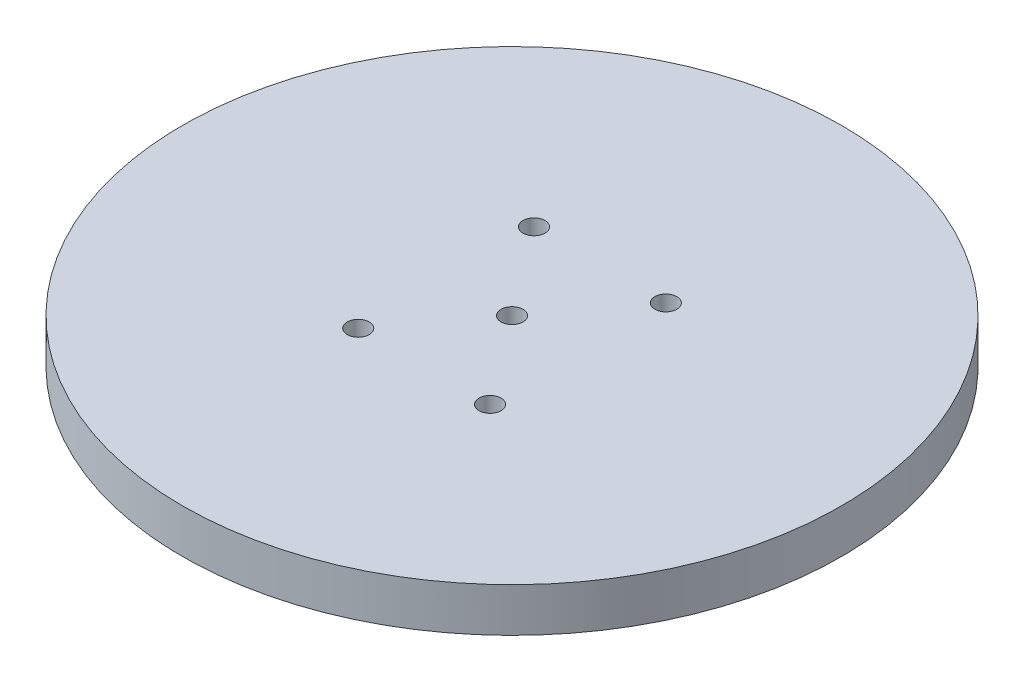
ISO-10303-21;
HEADER;
FILE_DESCRIPTION(('STEP AP214'),'2;1');
FILE_NAME('part.step','',(''),(''),'','','');
FILE_SCHEMA(('AUTOMOTIVE_DESIGN { 1 0 10303 214 1 1 1 1 }'));
ENDSEC;
DATA;
#1=APPLICATION_CONTEXT('core data for automotive mechanical design processes');
#2=APPLICATION_PROTOCOL_DEFINITION('international standard','automotive_design',2000,#1);
#3=PRODUCT_CONTEXT('',#1,'mechanical');
#4=PRODUCT('Part','Part','',(#3));
#5=PRODUCT_RELATED_PRODUCT_CATEGORY('part','',(#4));
#6=PRODUCT_DEFINITION_FORMATION('','',#4);
#7=PRODUCT_DEFINITION_CONTEXT('part definition',#1,'design');
#8=PRODUCT_DEFINITION('design','',#6,#7);
#9=PRODUCT_DEFINITION_SHAPE('','',#8);
#10=(LENGTH_UNIT() NAMED_UNIT(*) SI_UNIT(.MILLI.,.METRE.));
#11=(NAMED_UNIT(*) PLANE_ANGLE_UNIT() SI_UNIT($,.RADIAN.));
#12=(NAMED_UNIT(*) SI_UNIT($,.STERADIAN.) SOLID_ANGLE_UNIT());
#13=UNCERTAINTY_MEASURE_WITH_UNIT(LENGTH_MEASURE(1.E-05),#10,'distance_accuracy_value','');
#14=(GEOMETRIC_REPRESENTATION_CONTEXT(3) GLOBAL_UNCERTAINTY_ASSIGNED_CONTEXT((#13)) GLOBAL_UNIT_ASSIGNED_CONTEXT((#10,
#11,#12)) REPRESENTATION_CONTEXT('',''));
#15=CARTESIAN_POINT('',(0.,0.,0.));
#16=DIRECTION('',(0.,0.,1.));
#17=DIRECTION('',(1.,0.,0.));
#18=AXIS2_PLACEMENT_3D('',#15,#16,#17);
#19=CARTESIAN_POINT('',(0.,30.,0.));
#20=DIRECTION('',(0.,-1.,0.));
#21=DIRECTION('',(0.,0.,-1.));
#22=AXIS2_PLACEMENT_3D('',#19,#20,#21);
#23=CYLINDRICAL_SURFACE('',#22,75.);
#24=CARTESIAN_POINT('',(0.,30.,0.));
#25=DIRECTION('',(0.,1.,0.));
#26=DIRECTION('',(0.,0.,1.));
#27=AXIS2_PLACEMENT_3D('',#24,#25,#26);
#28=CIRCLE('',#27,75.);
#29=CARTESIAN_POINT('',(0.,30.,75.));
#30=VERTEX_POINT('',#29);
#31=EDGE_CURVE('E10',#30,#30,#28,.T.);
#32=ORIENTED_EDGE('',*,*,#31,.F.);
#33=EDGE_LOOP('',(#32));
#34=FACE_BOUND('',#33,.T.);
#35=CARTESIAN_POINT('',(0.,20.,0.));
#36=DIRECTION('',(0.,-1.,0.));
#37=DIRECTION('',(0.,0.,-1.));
#38=AXIS2_PLACEMENT_3D('',#35,#36,#37);
#39=CIRCLE('',#38,75.);
#40=CARTESIAN_POINT('',(0.,20.,-75.));
#41=VERTEX_POINT('',#40);
#42=EDGE_CURVE('E38',#41,#41,#39,.T.);
#43=ORIENTED_EDGE('',*,*,#42,.F.);
#44=EDGE_LOOP('',(#43));
#45=FACE_BOUND('',#44,.T.);
#46=ADVANCED_FACE('F32',(#34,#45),#23,.T.);
#47=CARTESIAN_POINT('',(0.,30.,0.));
#48=DIRECTION('',(0.,1.,0.));
#49=DIRECTION('',(0.,0.,1.));
#50=AXIS2_PLACEMENT_3D('',#47,#48,#49);
#51=PLANE('',#50);
#52=CARTESIAN_POINT('',(15.,30.,-20.));
#53=DIRECTION('',(0.,1.,0.));
#54=DIRECTION('',(0.,0.,1.));
#55=AXIS2_PLACEMENT_3D('',#52,#53,#54);
#56=CIRCLE('',#55,2.5);
#57=CARTESIAN_POINT('',(15.,30.,-17.5));
#58=VERTEX_POINT('',#57);
#59=EDGE_CURVE('E61',#58,#58,#56,.T.);
#60=ORIENTED_EDGE('',*,*,#59,.F.);
#61=EDGE_LOOP('',(#60));
#62=FACE_BOUND('',#61,.T.);
#63=CARTESIAN_POINT('',(-15.,30.,20.));
#64=DIRECTION('',(0.,1.,0.));
#65=DIRECTION('',(0.,0.,1.));
#66=AXIS2_PLACEMENT_3D('',#63,#64,#65);
#67=CIRCLE('',#66,2.5);
#68=CARTESIAN_POINT('',(-15.,30.,22.5));
#69=VERTEX_POINT('',#68);
#70=EDGE_CURVE('E67',#69,#69,#67,.T.);
#71=ORIENTED_EDGE('',*,*,#70,.F.);
#72=EDGE_LOOP('',(#71));
#73=FACE_BOUND('',#72,.T.);
#74=CARTESIAN_POINT('',(15.,30.,20.));
#75=DIRECTION('',(0.,1.,0.));
#76=DIRECTION('',(0.,0.,1.));
#77=AXIS2_PLACEMENT_3D('',#74,#75,#76);
#78=CIRCLE('',#77,2.5);
#79=CARTESIAN_POINT('',(15.,30.,22.5));
#80=VERTEX_POINT('',#79);
#81=EDGE_CURVE('E68',#80,#80,#78,.T.);
#82=ORIENTED_EDGE('',*,*,#81,.F.);
#83=EDGE_LOOP('',(#82));
#84=FACE_BOUND('',#83,.T.);
#85=CARTESIAN_POINT('',(-15.,30.,-20.));
#86=DIRECTION('',(0.,1.,0.));
#87=DIRECTION('',(0.,0.,1.));
#88=AXIS2_PLACEMENT_3D('',#85,#86,#87);
#89=CIRCLE('',#88,2.5);
#90=CARTESIAN_POINT('',(-15.,30.,-17.5));
#91=VERTEX_POINT('',#90);
#92=EDGE_CURVE('E58',#91,#91,#89,.T.);
#93=ORIENTED_EDGE('',*,*,#92,.F.);
#94=EDGE_LOOP('',(#93));
#95=FACE_BOUND('',#94,.T.);
#96=CARTESIAN_POINT('',(0.,30.,0.));
#97=DIRECTION('',(0.,1.,0.));
#98=DIRECTION('',(0.,0.,1.));
#99=AXIS2_PLACEMENT_3D('',#96,#97,#98);
#100=CIRCLE('',#99,2.5);
#101=CARTESIAN_POINT('',(0.,30.,2.5));
#102=VERTEX_POINT('',#101);
#103=EDGE_CURVE('E52',#102,#102,#100,.T.);
#104=ORIENTED_EDGE('',*,*,#103,.F.);
#105=EDGE_LOOP('',(#104));
#106=FACE_BOUND('',#105,.T.);
#107=ORIENTED_EDGE('',*,*,#31,.T.);
#108=EDGE_LOOP('',(#107));
#109=FACE_BOUND('',#108,.T.);
#110=ADVANCED_FACE('F84',(#62,#73,#84,#95,#106,#109),#51,.T.);
#111=CARTESIAN_POINT('',(0.,20.,0.));
#112=DIRECTION('',(0.,-1.,0.));
#113=DIRECTION('',(0.,0.,-1.));
#114=AXIS2_PLACEMENT_3D('',#111,#112,#113);
#115=PLANE('',#114);
#116=CARTESIAN_POINT('',(15.,20.,-20.));
#117=DIRECTION('',(0.,1.,0.));
#118=DIRECTION('',(0.,0.,1.));
#119=AXIS2_PLACEMENT_3D('',#116,#117,#118);
#120=CIRCLE('',#119,2.5);
#121=CARTESIAN_POINT('',(15.,20.,-17.5));
#122=VERTEX_POINT('',#121);
#123=EDGE_CURVE('E71',#122,#122,#120,.T.);
#124=ORIENTED_EDGE('',*,*,#123,.T.);
#125=EDGE_LOOP('',(#124));
#126=FACE_BOUND('',#125,.T.);
#127=CARTESIAN_POINT('',(-15.,20.,20.));
#128=DIRECTION('',(0.,1.,0.));
#129=DIRECTION('',(0.,0.,1.));
#130=AXIS2_PLACEMENT_3D('',#127,#128,#129);
#131=CIRCLE('',#130,2.5);
#132=CARTESIAN_POINT('',(-15.,20.,22.5));
#133=VERTEX_POINT('',#132);
#134=EDGE_CURVE('E64',#133,#133,#131,.T.);
#135=ORIENTED_EDGE('',*,*,#134,.T.);
#136=EDGE_LOOP('',(#135));
#137=FACE_BOUND('',#136,.T.);
#138=CARTESIAN_POINT('',(15.,20.,20.));
#139=DIRECTION('',(0.,1.,0.));
#140=DIRECTION('',(0.,0.,1.));
#141=AXIS2_PLACEMENT_3D('',#138,#139,#140);
#142=CIRCLE('',#141,2.5);
#143=CARTESIAN_POINT('',(15.,20.,22.5));
#144=VERTEX_POINT('',#143);
#145=EDGE_CURVE('E76',#144,#144,#142,.T.);
#146=ORIENTED_EDGE('',*,*,#145,.T.);
#147=EDGE_LOOP('',(#146));
#148=FACE_BOUND('',#147,.T.);
#149=CARTESIAN_POINT('',(-15.,20.,-20.));
#150=DIRECTION('',(0.,1.,0.));
#151=DIRECTION('',(0.,0.,1.));
#152=AXIS2_PLACEMENT_3D('',#149,#150,#151);
#153=CIRCLE('',#152,2.5);
#154=CARTESIAN_POINT('',(-15.,20.,-17.5));
#155=VERTEX_POINT('',#154);
#156=EDGE_CURVE('E55',#155,#155,#153,.T.);
#157=ORIENTED_EDGE('',*,*,#156,.T.);
#158=EDGE_LOOP('',(#157));
#159=FACE_BOUND('',#158,.T.);
#160=CARTESIAN_POINT('',(0.,20.,0.));
#161=DIRECTION('',(0.,-1.,0.));
#162=DIRECTION('',(0.,0.,-1.));
#163=AXIS2_PLACEMENT_3D('',#160,#161,#162);
#164=CIRCLE('',#163,7.5);
#165=CARTESIAN_POINT('',(0.,20.,-7.5));
#166=VERTEX_POINT('',#165);
#167=EDGE_CURVE('E42',#166,#166,#164,.T.);
#168=ORIENTED_EDGE('',*,*,#167,.F.);
#169=EDGE_LOOP('',(#168));
#170=FACE_BOUND('',#169,.T.);
#171=ORIENTED_EDGE('',*,*,#42,.T.);
#172=EDGE_LOOP('',(#171));
#173=FACE_BOUND('',#172,.T.);
#174=ADVANCED_FACE('F87',(#126,#137,#148,#159,#170,#173),#115,.T.);
#175=CARTESIAN_POINT('',(0.,20.,0.));
#176=DIRECTION('',(0.,-1.,0.));
#177=DIRECTION('',(0.,0.,-1.));
#178=AXIS2_PLACEMENT_3D('',#175,#176,#177);
#179=CYLINDRICAL_SURFACE('',#178,7.5);
#180=ORIENTED_EDGE('',*,*,#167,.T.);
#181=EDGE_LOOP('',(#180));
#182=FACE_BOUND('',#181,.T.);
#183=CARTESIAN_POINT('',(0.,0.,0.));
#184=DIRECTION('',(0.,-1.,0.));
#185=DIRECTION('',(0.,0.,-1.));
#186=AXIS2_PLACEMENT_3D('',#183,#184,#185);
#187=CIRCLE('',#186,7.5);
#188=CARTESIAN_POINT('',(0.,0.,-7.5));
#189=VERTEX_POINT('',#188);
#190=EDGE_CURVE('E46',#189,#189,#187,.T.);
#191=ORIENTED_EDGE('',*,*,#190,.F.);
#192=EDGE_LOOP('',(#191));
#193=FACE_BOUND('',#192,.T.);
#194=ADVANCED_FACE('F106',(#182,#193),#179,.T.);
#195=CARTESIAN_POINT('',(0.,0.,0.));
#196=DIRECTION('',(0.,1.,0.));
#197=DIRECTION('',(0.,0.,1.));
#198=AXIS2_PLACEMENT_3D('',#195,#196,#197);
#199=PLANE('',#198);
#200=CARTESIAN_POINT('',(0.,0.,0.));
#201=DIRECTION('',(0.,1.,0.));
#202=DIRECTION('',(0.,0.,1.));
#203=AXIS2_PLACEMENT_3D('',#200,#201,#202);
#204=CIRCLE('',#203,2.5);
#205=CARTESIAN_POINT('',(0.,0.,2.5));
#206=VERTEX_POINT('',#205);
#207=EDGE_CURVE('E50',#206,#206,#204,.T.);
#208=ORIENTED_EDGE('',*,*,#207,.T.);
#209=EDGE_LOOP('',(#208));
#210=FACE_BOUND('',#209,.T.);
#211=ORIENTED_EDGE('',*,*,#190,.T.);
#212=EDGE_LOOP('',(#211));
#213=FACE_BOUND('',#212,.T.);
#214=ADVANCED_FACE('F97',(#210,#213),#199,.F.);
#215=CARTESIAN_POINT('',(0.,0.,0.));
#216=DIRECTION('',(0.,1.,0.));
#217=DIRECTION('',(0.,0.,1.));
#218=AXIS2_PLACEMENT_3D('',#215,#216,#217);
#219=CYLINDRICAL_SURFACE('',#218,2.5);
#220=ORIENTED_EDGE('',*,*,#207,.F.);
#221=EDGE_LOOP('',(#220));
#222=FACE_BOUND('',#221,.T.);
#223=ORIENTED_EDGE('',*,*,#103,.T.);
#224=EDGE_LOOP('',(#223));
#225=FACE_BOUND('',#224,.T.);
#226=ADVANCED_FACE('F94',(#222,#225),#219,.F.);
#227=CARTESIAN_POINT('',(-15.,20.,-20.));
#228=DIRECTION('',(0.,1.,0.));
#229=DIRECTION('',(0.,0.,1.));
#230=AXIS2_PLACEMENT_3D('',#227,#228,#229);
#231=CYLINDRICAL_SURFACE('',#230,2.5);
#232=ORIENTED_EDGE('',*,*,#156,.F.);
#233=EDGE_LOOP('',(#232));
#234=FACE_BOUND('',#233,.T.);
#235=ORIENTED_EDGE('',*,*,#92,.T.);
#236=EDGE_LOOP('',(#235));
#237=FACE_BOUND('',#236,.T.);
#238=ADVANCED_FACE('F96',(#234,#237),#231,.F.);
#239=CARTESIAN_POINT('',(15.,20.,20.));
#240=DIRECTION('',(0.,1.,0.));
#241=DIRECTION('',(0.,0.,1.));
#242=AXIS2_PLACEMENT_3D('',#239,#240,#241);
#243=CYLINDRICAL_SURFACE('',#242,2.5);
#244=ORIENTED_EDGE('',*,*,#145,.F.);
#245=EDGE_LOOP('',(#244));
#246=FACE_BOUND('',#245,.T.);
#247=ORIENTED_EDGE('',*,*,#81,.T.);
#248=EDGE_LOOP('',(#247));
#249=FACE_BOUND('',#248,.T.);
#250=ADVANCED_FACE('F82',(#246,#249),#243,.F.);
#251=CARTESIAN_POINT('',(-15.,20.,20.));
#252=DIRECTION('',(0.,1.,0.));
#253=DIRECTION('',(0.,0.,1.));
#254=AXIS2_PLACEMENT_3D('',#251,#252,#253);
#255=CYLINDRICAL_SURFACE('',#254,2.5);
#256=ORIENTED_EDGE('',*,*,#134,.F.);
#257=EDGE_LOOP('',(#256));
#258=FACE_BOUND('',#257,.T.);
#259=ORIENTED_EDGE('',*,*,#70,.T.);
#260=EDGE_LOOP('',(#259));
#261=FACE_BOUND('',#260,.T.);
#262=ADVANCED_FACE('F157',(#258,#261),#255,.F.);
#263=CARTESIAN_POINT('',(15.,20.,-20.));
#264=DIRECTION('',(0.,1.,0.));
#265=DIRECTION('',(0.,0.,1.));
#266=AXIS2_PLACEMENT_3D('',#263,#264,#265);
#267=CYLINDRICAL_SURFACE('',#266,2.5);
#268=ORIENTED_EDGE('',*,*,#123,.F.);
#269=EDGE_LOOP('',(#268));
#270=FACE_BOUND('',#269,.T.);
#271=ORIENTED_EDGE('',*,*,#59,.T.);
#272=EDGE_LOOP('',(#271));
#273=FACE_BOUND('',#272,.T.);
#274=ADVANCED_FACE('F166',(#270,#273),#267,.F.);
#275=CLOSED_SHELL('',(#46,#110,#174,#194,#214,#226,#238,#250,#262,#274));
#276=MANIFOLD_SOLID_BREP('B2',#275);
#277=ADVANCED_BREP_SHAPE_REPRESENTATION('',(#18,#276),#14);
#278=SHAPE_DEFINITION_REPRESENTATION(#9,#277);
ENDSEC;
END-ISO-10303-21;
